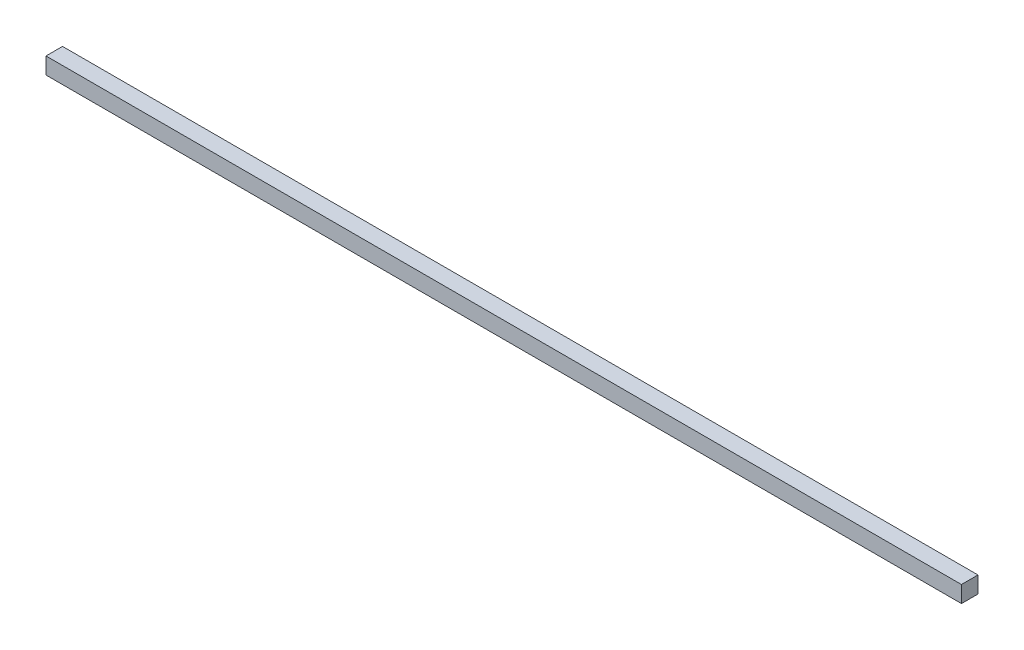
ISO-10303-21;
HEADER;
FILE_DESCRIPTION(('STEP AP214'),'2;1');
FILE_NAME('part.step','',(''),(''),'','','');
FILE_SCHEMA(('AUTOMOTIVE_DESIGN { 1 0 10303 214 1 1 1 1 }'));
ENDSEC;
DATA;
#1=APPLICATION_CONTEXT('core data for automotive mechanical design processes');
#2=APPLICATION_PROTOCOL_DEFINITION('international standard','automotive_design',2000,#1);
#3=PRODUCT_CONTEXT('',#1,'mechanical');
#4=PRODUCT('Part','Part','',(#3));
#5=PRODUCT_RELATED_PRODUCT_CATEGORY('part','',(#4));
#6=PRODUCT_DEFINITION_FORMATION('','',#4);
#7=PRODUCT_DEFINITION_CONTEXT('part definition',#1,'design');
#8=PRODUCT_DEFINITION('design','',#6,#7);
#9=PRODUCT_DEFINITION_SHAPE('','',#8);
#10=(LENGTH_UNIT() NAMED_UNIT(*) SI_UNIT(.MILLI.,.METRE.));
#11=(NAMED_UNIT(*) PLANE_ANGLE_UNIT() SI_UNIT($,.RADIAN.));
#12=(NAMED_UNIT(*) SI_UNIT($,.STERADIAN.) SOLID_ANGLE_UNIT());
#13=UNCERTAINTY_MEASURE_WITH_UNIT(LENGTH_MEASURE(1.E-05),#10,'distance_accuracy_value','');
#14=(GEOMETRIC_REPRESENTATION_CONTEXT(3) GLOBAL_UNCERTAINTY_ASSIGNED_CONTEXT((#13)) GLOBAL_UNIT_ASSIGNED_CONTEXT((#10,
#11,#12)) REPRESENTATION_CONTEXT('',''));
#15=CARTESIAN_POINT('',(0.,0.,0.));
#16=DIRECTION('',(0.,0.,1.));
#17=DIRECTION('',(1.,0.,0.));
#18=AXIS2_PLACEMENT_3D('',#15,#16,#17);
#19=CARTESIAN_POINT('',(-654.949491946867,0.,-1.3035161883412E-13));
#20=DIRECTION('',(1.,0.,0.));
#21=DIRECTION('',(0.,0.,-1.));
#22=AXIS2_PLACEMENT_3D('',#19,#20,#21);
#23=PLANE('',#22);
#24=DIRECTION('',(0.,-1.,0.));
#25=VECTOR('',#24,1.);
#26=CARTESIAN_POINT('',(-654.949491946867,39.1071428571427,-4.64285714285712));
#27=LINE('',#26,#25);
#28=CARTESIAN_POINT('',(-654.949491946867,-20.8928571428571,-4.64285714285712));
#29=VERTEX_POINT('',#28);
#30=CARTESIAN_POINT('',(-654.949491946867,-40.8928571428572,-4.64285714285712));
#31=VERTEX_POINT('',#30);
#32=EDGE_CURVE('E89',#29,#31,#27,.T.);
#33=ORIENTED_EDGE('',*,*,#32,.F.);
#34=DIRECTION('',(0.,0.,1.));
#35=VECTOR('',#34,1.);
#36=CARTESIAN_POINT('',(-654.949491946867,-20.8928571428571,-14.6428571428573));
#37=LINE('',#36,#35);
#38=CARTESIAN_POINT('',(-654.949491946867,-20.8928571428571,-24.6428571428571));
#39=VERTEX_POINT('',#38);
#40=EDGE_CURVE('E100',#39,#29,#37,.T.);
#41=ORIENTED_EDGE('',*,*,#40,.F.);
#42=DIRECTION('',(0.,1.,0.));
#43=VECTOR('',#42,1.);
#44=CARTESIAN_POINT('',(-654.949491946867,39.1071428571427,-24.6428571428571));
#45=LINE('',#44,#43);
#46=CARTESIAN_POINT('',(-654.949491946867,-40.8928571428571,-24.6428571428571));
#47=VERTEX_POINT('',#46);
#48=EDGE_CURVE('E91',#47,#39,#45,.T.);
#49=ORIENTED_EDGE('',*,*,#48,.F.);
#50=DIRECTION('',(0.,0.,-1.));
#51=VECTOR('',#50,1.);
#52=CARTESIAN_POINT('',(-654.949491946867,-40.8928571428571,-14.6428571428573));
#53=LINE('',#52,#51);
#54=EDGE_CURVE('E81',#31,#47,#53,.T.);
#55=ORIENTED_EDGE('',*,*,#54,.F.);
#56=EDGE_LOOP('',(#33,#41,#49,#55));
#57=FACE_BOUND('',#56,.T.);
#58=ADVANCED_FACE('F39',(#57),#23,.F.);
#59=CARTESIAN_POINT('',(480.134779300595,-20.8928571428571,-14.6428571428573));
#60=DIRECTION('',(0.,-1.,0.));
#61=DIRECTION('',(0.,0.,-1.));
#62=AXIS2_PLACEMENT_3D('',#59,#60,#61);
#63=PLANE('',#62);
#64=DIRECTION('',(-1.,0.,0.));
#65=VECTOR('',#64,1.);
#66=CARTESIAN_POINT('',(480.134779300595,-20.8928571428571,-4.64285714285712));
#67=LINE('',#66,#65);
#68=CARTESIAN_POINT('',(451.850508053133,-20.8928571428571,-4.64285714285712));
#69=VERTEX_POINT('',#68);
#70=EDGE_CURVE('E94',#69,#29,#67,.T.);
#71=ORIENTED_EDGE('',*,*,#70,.F.);
#72=DIRECTION('',(0.,0.,-1.));
#73=VECTOR('',#72,1.);
#74=CARTESIAN_POINT('',(451.850508053133,-20.8928571428571,-14.6428571428573));
#75=LINE('',#74,#73);
#76=CARTESIAN_POINT('',(451.850508053133,-20.8928571428571,-24.6428571428571));
#77=VERTEX_POINT('',#76);
#78=EDGE_CURVE('E43',#69,#77,#75,.T.);
#79=ORIENTED_EDGE('',*,*,#78,.T.);
#80=DIRECTION('',(-1.,0.,0.));
#81=VECTOR('',#80,1.);
#82=CARTESIAN_POINT('',(480.134779300595,-20.8928571428571,-24.6428571428571));
#83=LINE('',#82,#81);
#84=EDGE_CURVE('E103',#77,#39,#83,.T.);
#85=ORIENTED_EDGE('',*,*,#84,.T.);
#86=ORIENTED_EDGE('',*,*,#40,.T.);
#87=EDGE_LOOP('',(#71,#79,#85,#86));
#88=FACE_BOUND('',#87,.T.);
#89=ADVANCED_FACE('F112',(#88),#63,.F.);
#90=CARTESIAN_POINT('',(480.134779300595,39.1071428571427,-24.6428571428571));
#91=DIRECTION('',(0.,0.,1.));
#92=DIRECTION('',(0.,-1.,0.));
#93=AXIS2_PLACEMENT_3D('',#90,#91,#92);
#94=PLANE('',#93);
#95=ORIENTED_EDGE('',*,*,#84,.F.);
#96=DIRECTION('',(0.,-1.,0.));
#97=VECTOR('',#96,1.);
#98=CARTESIAN_POINT('',(451.850508053133,39.1071428571427,-24.6428571428571));
#99=LINE('',#98,#97);
#100=CARTESIAN_POINT('',(451.850508053133,-40.8928571428571,-24.6428571428571));
#101=VERTEX_POINT('',#100);
#102=EDGE_CURVE('E109',#77,#101,#99,.T.);
#103=ORIENTED_EDGE('',*,*,#102,.T.);
#104=DIRECTION('',(-1.,0.,0.));
#105=VECTOR('',#104,1.);
#106=CARTESIAN_POINT('',(480.134779300595,-40.8928571428571,-24.6428571428571));
#107=LINE('',#106,#105);
#108=EDGE_CURVE('E85',#101,#47,#107,.T.);
#109=ORIENTED_EDGE('',*,*,#108,.T.);
#110=ORIENTED_EDGE('',*,*,#48,.T.);
#111=EDGE_LOOP('',(#95,#103,#109,#110));
#112=FACE_BOUND('',#111,.T.);
#113=ADVANCED_FACE('F108',(#112),#94,.F.);
#114=CARTESIAN_POINT('',(480.134779300595,-40.8928571428571,-14.6428571428573));
#115=DIRECTION('',(0.,1.,0.));
#116=DIRECTION('',(0.,0.,1.));
#117=AXIS2_PLACEMENT_3D('',#114,#115,#116);
#118=PLANE('',#117);
#119=ORIENTED_EDGE('',*,*,#108,.F.);
#120=DIRECTION('',(0.,0.,1.));
#121=VECTOR('',#120,1.);
#122=CARTESIAN_POINT('',(451.850508053133,-40.8928571428571,-14.6428571428573));
#123=LINE('',#122,#121);
#124=CARTESIAN_POINT('',(451.850508053133,-40.8928571428572,-4.64285714285712));
#125=VERTEX_POINT('',#124);
#126=EDGE_CURVE('E48',#101,#125,#123,.T.);
#127=ORIENTED_EDGE('',*,*,#126,.T.);
#128=DIRECTION('',(-1.,0.,0.));
#129=VECTOR('',#128,1.);
#130=CARTESIAN_POINT('',(480.134779300595,-40.8928571428572,-4.64285714285712));
#131=LINE('',#130,#129);
#132=EDGE_CURVE('E78',#125,#31,#131,.T.);
#133=ORIENTED_EDGE('',*,*,#132,.T.);
#134=ORIENTED_EDGE('',*,*,#54,.T.);
#135=EDGE_LOOP('',(#119,#127,#133,#134));
#136=FACE_BOUND('',#135,.T.);
#137=ADVANCED_FACE('F80',(#136),#118,.F.);
#138=CARTESIAN_POINT('',(480.134779300595,39.1071428571427,-4.64285714285712));
#139=DIRECTION('',(0.,0.,-1.));
#140=DIRECTION('',(-1.,0.,0.));
#141=AXIS2_PLACEMENT_3D('',#138,#139,#140);
#142=PLANE('',#141);
#143=ORIENTED_EDGE('',*,*,#132,.F.);
#144=DIRECTION('',(0.,1.,0.));
#145=VECTOR('',#144,1.);
#146=CARTESIAN_POINT('',(451.850508053133,39.1071428571427,-4.64285714285712));
#147=LINE('',#146,#145);
#148=EDGE_CURVE('E11',#125,#69,#147,.T.);
#149=ORIENTED_EDGE('',*,*,#148,.T.);
#150=ORIENTED_EDGE('',*,*,#70,.T.);
#151=ORIENTED_EDGE('',*,*,#32,.T.);
#152=EDGE_LOOP('',(#143,#149,#150,#151));
#153=FACE_BOUND('',#152,.T.);
#154=ADVANCED_FACE('F41',(#153),#142,.F.);
#155=CARTESIAN_POINT('',(451.850508053133,56.6432355723748,-10.6057710501418));
#156=DIRECTION('',(-1.,0.,0.));
#157=DIRECTION('',(0.,0.,1.));
#158=AXIS2_PLACEMENT_3D('',#155,#156,#157);
#159=PLANE('',#158);
#160=ORIENTED_EDGE('',*,*,#126,.F.);
#161=ORIENTED_EDGE('',*,*,#102,.F.);
#162=ORIENTED_EDGE('',*,*,#78,.F.);
#163=ORIENTED_EDGE('',*,*,#148,.F.);
#164=EDGE_LOOP('',(#160,#161,#162,#163));
#165=FACE_BOUND('',#164,.T.);
#166=ADVANCED_FACE('F126',(#165),#159,.F.);
#167=CLOSED_SHELL('',(#58,#89,#113,#137,#154,#166));
#168=MANIFOLD_SOLID_BREP('B2',#167);
#169=ADVANCED_BREP_SHAPE_REPRESENTATION('',(#18,#168),#14);
#170=SHAPE_DEFINITION_REPRESENTATION(#9,#169);
ENDSEC;
END-ISO-10303-21;
